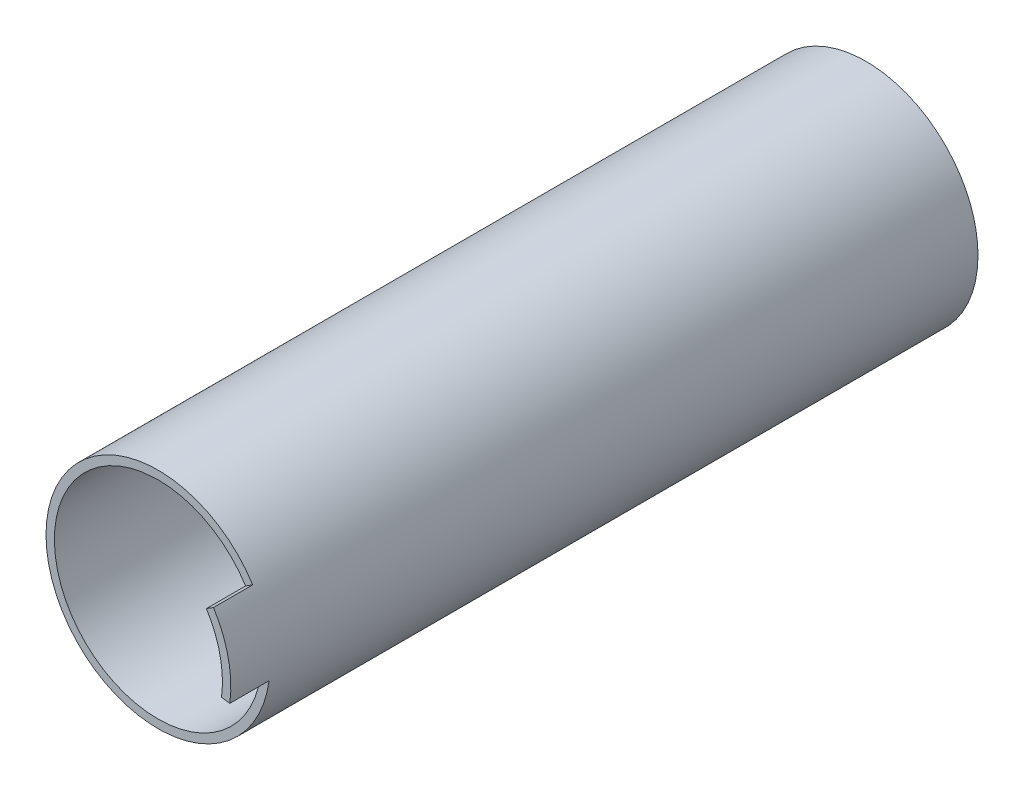
ISO-10303-21;
HEADER;
FILE_DESCRIPTION(('STEP AP214'),'2;1');
FILE_NAME('part.step','',(''),(''),'','','');
FILE_SCHEMA(('AUTOMOTIVE_DESIGN { 1 0 10303 214 1 1 1 1 }'));
ENDSEC;
DATA;
#1=APPLICATION_CONTEXT('core data for automotive mechanical design processes');
#2=APPLICATION_PROTOCOL_DEFINITION('international standard','automotive_design',2000,#1);
#3=PRODUCT_CONTEXT('',#1,'mechanical');
#4=PRODUCT('Part','Part','',(#3));
#5=PRODUCT_RELATED_PRODUCT_CATEGORY('part','',(#4));
#6=PRODUCT_DEFINITION_FORMATION('','',#4);
#7=PRODUCT_DEFINITION_CONTEXT('part definition',#1,'design');
#8=PRODUCT_DEFINITION('design','',#6,#7);
#9=PRODUCT_DEFINITION_SHAPE('','',#8);
#10=(LENGTH_UNIT() NAMED_UNIT(*) SI_UNIT(.MILLI.,.METRE.));
#11=(NAMED_UNIT(*) PLANE_ANGLE_UNIT() SI_UNIT($,.RADIAN.));
#12=(NAMED_UNIT(*) SI_UNIT($,.STERADIAN.) SOLID_ANGLE_UNIT());
#13=UNCERTAINTY_MEASURE_WITH_UNIT(LENGTH_MEASURE(1.E-05),#10,'distance_accuracy_value','');
#14=(GEOMETRIC_REPRESENTATION_CONTEXT(3) GLOBAL_UNCERTAINTY_ASSIGNED_CONTEXT((#13)) GLOBAL_UNIT_ASSIGNED_CONTEXT((#10,
#11,#12)) REPRESENTATION_CONTEXT('',''));
#15=CARTESIAN_POINT('',(0.,0.,0.));
#16=DIRECTION('',(0.,0.,1.));
#17=DIRECTION('',(1.,0.,0.));
#18=AXIS2_PLACEMENT_3D('',#15,#16,#17);
#19=CARTESIAN_POINT('',(0.,0.,0.));
#20=DIRECTION('',(0.,0.,-1.));
#21=DIRECTION('',(-1.,0.,0.));
#22=AXIS2_PLACEMENT_3D('',#19,#20,#21);
#23=PLANE('',#22);
#24=CARTESIAN_POINT('',(0.,0.,0.));
#25=DIRECTION('',(0.,0.,1.));
#26=DIRECTION('',(-1.,0.,0.));
#27=AXIS2_PLACEMENT_3D('',#24,#25,#26);
#28=CIRCLE('',#27,5.);
#29=CARTESIAN_POINT('',(-5.,0.,0.));
#30=VERTEX_POINT('',#29);
#31=CARTESIAN_POINT('',(5.,0.,0.));
#32=VERTEX_POINT('',#31);
#33=EDGE_CURVE('E103',#30,#32,#28,.T.);
#34=ORIENTED_EDGE('',*,*,#33,.F.);
#35=DIRECTION('',(0.,-1.,0.));
#36=VECTOR('',#35,1.);
#37=CARTESIAN_POINT('',(-5.,0.,0.));
#38=LINE('',#37,#36);
#39=CARTESIAN_POINT('',(-5.,16.7705098312484,0.));
#40=VERTEX_POINT('',#39);
#41=EDGE_CURVE('E57',#40,#30,#38,.T.);
#42=ORIENTED_EDGE('',*,*,#41,.F.);
#43=CARTESIAN_POINT('',(0.,0.,0.));
#44=DIRECTION('',(0.,0.,1.));
#45=DIRECTION('',(1.,0.,0.));
#46=AXIS2_PLACEMENT_3D('',#43,#44,#45);
#47=CIRCLE('',#46,17.5);
#48=CARTESIAN_POINT('',(5.,16.7705098312484,0.));
#49=VERTEX_POINT('',#48);
#50=EDGE_CURVE('E104',#49,#40,#47,.T.);
#51=ORIENTED_EDGE('',*,*,#50,.F.);
#52=DIRECTION('',(0.,1.,0.));
#53=VECTOR('',#52,1.);
#54=CARTESIAN_POINT('',(5.,0.,0.));
#55=LINE('',#54,#53);
#56=EDGE_CURVE('E93',#32,#49,#55,.T.);
#57=ORIENTED_EDGE('',*,*,#56,.F.);
#58=EDGE_LOOP('',(#34,#42,#51,#57));
#59=FACE_BOUND('',#58,.T.);
#60=CARTESIAN_POINT('',(0.,0.,0.));
#61=DIRECTION('',(0.,0.,1.));
#62=DIRECTION('',(1.,0.,0.));
#63=AXIS2_PLACEMENT_3D('',#60,#61,#62);
#64=CIRCLE('',#63,2.99999999999862);
#65=CARTESIAN_POINT('',(-2.99999999999862,0.,0.));
#66=VERTEX_POINT('',#65);
#67=EDGE_CURVE('E116',#66,#66,#64,.T.);
#68=ORIENTED_EDGE('',*,*,#67,.T.);
#69=EDGE_LOOP('',(#68));
#70=FACE_BOUND('',#69,.T.);
#71=ADVANCED_FACE('F48',(#59,#70),#23,.T.);
#72=CARTESIAN_POINT('',(0.,0.,83.6221445044903));
#73=DIRECTION('',(0.,0.,-1.));
#74=DIRECTION('',(-1.,0.,0.));
#75=AXIS2_PLACEMENT_3D('',#72,#73,#74);
#76=CYLINDRICAL_SURFACE('',#75,5.);
#77=DIRECTION('',(0.,0.,-1.));
#78=VECTOR('',#77,1.);
#79=CARTESIAN_POINT('',(5.,0.,83.6221445044903));
#80=LINE('',#79,#78);
#81=CARTESIAN_POINT('',(5.,0.,58.6));
#82=VERTEX_POINT('',#81);
#83=EDGE_CURVE('E90',#82,#32,#80,.T.);
#84=ORIENTED_EDGE('',*,*,#83,.F.);
#85=CARTESIAN_POINT('',(0.,0.,58.6));
#86=DIRECTION('',(0.,0.,-1.));
#87=DIRECTION('',(-1.,0.,0.));
#88=AXIS2_PLACEMENT_3D('',#85,#86,#87);
#89=CIRCLE('',#88,5.);
#90=CARTESIAN_POINT('',(-5.,0.,58.6));
#91=VERTEX_POINT('',#90);
#92=EDGE_CURVE('E65',#82,#91,#89,.T.);
#93=ORIENTED_EDGE('',*,*,#92,.T.);
#94=DIRECTION('',(0.,0.,-1.));
#95=VECTOR('',#94,1.);
#96=CARTESIAN_POINT('',(-5.,0.,83.6221445044903));
#97=LINE('',#96,#95);
#98=EDGE_CURVE('E109',#91,#30,#97,.T.);
#99=ORIENTED_EDGE('',*,*,#98,.T.);
#100=ORIENTED_EDGE('',*,*,#33,.T.);
#101=EDGE_LOOP('',(#84,#93,#99,#100));
#102=FACE_BOUND('',#101,.T.);
#103=ADVANCED_FACE('F107',(#102),#76,.T.);
#104=CARTESIAN_POINT('',(5.,0.,83.6221445044903));
#105=DIRECTION('',(-1.,0.,0.));
#106=DIRECTION('',(0.,-1.,0.));
#107=AXIS2_PLACEMENT_3D('',#104,#105,#106);
#108=PLANE('',#107);
#109=DIRECTION('',(0.,0.,-1.));
#110=VECTOR('',#109,1.);
#111=CARTESIAN_POINT('',(5.,16.7705098312484,83.6221445044903));
#112=LINE('',#111,#110);
#113=CARTESIAN_POINT('',(5.,16.7705098312484,58.6));
#114=VERTEX_POINT('',#113);
#115=EDGE_CURVE('E85',#114,#49,#112,.T.);
#116=ORIENTED_EDGE('',*,*,#115,.F.);
#117=DIRECTION('',(0.,-1.,0.));
#118=VECTOR('',#117,1.);
#119=CARTESIAN_POINT('',(5.,0.,58.6));
#120=LINE('',#119,#118);
#121=EDGE_CURVE('E95',#114,#82,#120,.T.);
#122=ORIENTED_EDGE('',*,*,#121,.T.);
#123=ORIENTED_EDGE('',*,*,#83,.T.);
#124=ORIENTED_EDGE('',*,*,#56,.T.);
#125=EDGE_LOOP('',(#116,#122,#123,#124));
#126=FACE_BOUND('',#125,.T.);
#127=ADVANCED_FACE('F92',(#126),#108,.F.);
#128=CARTESIAN_POINT('',(0.,0.,83.6221445044903));
#129=DIRECTION('',(0.,0.,-1.));
#130=DIRECTION('',(-1.,0.,0.));
#131=AXIS2_PLACEMENT_3D('',#128,#129,#130);
#132=CYLINDRICAL_SURFACE('',#131,17.5);
#133=DIRECTION('',(0.,0.,-1.));
#134=VECTOR('',#133,1.);
#135=CARTESIAN_POINT('',(-5.,16.7705098312484,83.6221445044903));
#136=LINE('',#135,#134);
#137=CARTESIAN_POINT('',(-5.,16.7705098312484,58.6));
#138=VERTEX_POINT('',#137);
#139=EDGE_CURVE('E120',#138,#40,#136,.T.);
#140=ORIENTED_EDGE('',*,*,#139,.F.);
#141=CARTESIAN_POINT('',(0.,0.,58.6));
#142=DIRECTION('',(0.,0.,-1.));
#143=DIRECTION('',(-1.,0.,0.));
#144=AXIS2_PLACEMENT_3D('',#141,#142,#143);
#145=CIRCLE('',#144,17.5);
#146=EDGE_CURVE('E105',#138,#114,#145,.T.);
#147=ORIENTED_EDGE('',*,*,#146,.T.);
#148=ORIENTED_EDGE('',*,*,#115,.T.);
#149=ORIENTED_EDGE('',*,*,#50,.T.);
#150=EDGE_LOOP('',(#140,#147,#148,#149));
#151=FACE_BOUND('',#150,.T.);
#152=ADVANCED_FACE('F129',(#151),#132,.T.);
#153=CARTESIAN_POINT('',(-5.,0.,83.6221445044903));
#154=DIRECTION('',(1.,0.,0.));
#155=DIRECTION('',(0.,1.,0.));
#156=AXIS2_PLACEMENT_3D('',#153,#154,#155);
#157=PLANE('',#156);
#158=ORIENTED_EDGE('',*,*,#98,.F.);
#159=DIRECTION('',(0.,1.,0.));
#160=VECTOR('',#159,1.);
#161=CARTESIAN_POINT('',(-5.,0.,58.6));
#162=LINE('',#161,#160);
#163=EDGE_CURVE('E121',#91,#138,#162,.T.);
#164=ORIENTED_EDGE('',*,*,#163,.T.);
#165=ORIENTED_EDGE('',*,*,#139,.T.);
#166=ORIENTED_EDGE('',*,*,#41,.T.);
#167=EDGE_LOOP('',(#158,#164,#165,#166));
#168=FACE_BOUND('',#167,.T.);
#169=ADVANCED_FACE('F128',(#168),#157,.F.);
#170=CARTESIAN_POINT('',(0.,0.,83.6221445044903));
#171=DIRECTION('',(0.,0.,-1.));
#172=DIRECTION('',(-1.,0.,0.));
#173=AXIS2_PLACEMENT_3D('',#170,#171,#172);
#174=CYLINDRICAL_SURFACE('',#173,2.99999999999862);
#175=CARTESIAN_POINT('',(0.,0.,58.6));
#176=DIRECTION('',(0.,0.,-1.));
#177=DIRECTION('',(-1.,0.,0.));
#178=AXIS2_PLACEMENT_3D('',#175,#176,#177);
#179=CIRCLE('',#178,2.99999999999862);
#180=CARTESIAN_POINT('',(-2.99999999999862,0.,58.6));
#181=VERTEX_POINT('',#180);
#182=EDGE_CURVE('E13',#181,#181,#179,.T.);
#183=CARTESIAN_POINT('',(-2.99999999999862,0.,58.6));
#184=CARTESIAN_POINT('',(-2.99999999999862,0.,57.9895833333333));
#185=CARTESIAN_POINT('',(-2.99999999999862,0.,57.3791666666667));
#186=CARTESIAN_POINT('',(-2.99999999999862,0.,56.1583333333333));
#187=CARTESIAN_POINT('',(-2.99999999999862,0.,55.5479166666667));
#188=CARTESIAN_POINT('',(-2.99999999999862,0.,54.3270833333333));
#189=CARTESIAN_POINT('',(-2.99999999999862,0.,53.7166666666667));
#190=CARTESIAN_POINT('',(-2.99999999999862,0.,52.4958333333333));
#191=CARTESIAN_POINT('',(-2.99999999999862,0.,51.8854166666667));
#192=CARTESIAN_POINT('',(-2.99999999999862,0.,50.6645833333333));
#193=CARTESIAN_POINT('',(-2.99999999999862,0.,50.0541666666667));
#194=CARTESIAN_POINT('',(-2.99999999999862,0.,48.8333333333333));
#195=CARTESIAN_POINT('',(-2.99999999999862,0.,48.2229166666667));
#196=CARTESIAN_POINT('',(-2.99999999999862,0.,47.0020833333333));
#197=CARTESIAN_POINT('',(-2.99999999999862,0.,46.3916666666667));
#198=CARTESIAN_POINT('',(-2.99999999999862,0.,45.1708333333333));
#199=CARTESIAN_POINT('',(-2.99999999999862,0.,44.5604166666667));
#200=CARTESIAN_POINT('',(-2.99999999999862,0.,43.3395833333333));
#201=CARTESIAN_POINT('',(-2.99999999999862,0.,42.7291666666667));
#202=CARTESIAN_POINT('',(-2.99999999999862,0.,41.5083333333333));
#203=CARTESIAN_POINT('',(-2.99999999999862,0.,40.8979166666667));
#204=CARTESIAN_POINT('',(-2.99999999999862,0.,39.6770833333333));
#205=CARTESIAN_POINT('',(-2.99999999999862,0.,39.0666666666667));
#206=CARTESIAN_POINT('',(-2.99999999999862,0.,37.8458333333333));
#207=CARTESIAN_POINT('',(-2.99999999999862,0.,37.2354166666667));
#208=CARTESIAN_POINT('',(-2.99999999999862,0.,36.0145833333333));
#209=CARTESIAN_POINT('',(-2.99999999999862,0.,35.4041666666667));
#210=CARTESIAN_POINT('',(-2.99999999999862,0.,34.1833333333333));
#211=CARTESIAN_POINT('',(-2.99999999999862,0.,33.5729166666667));
#212=CARTESIAN_POINT('',(-2.99999999999862,0.,32.3520833333333));
#213=CARTESIAN_POINT('',(-2.99999999999862,0.,31.7416666666667));
#214=CARTESIAN_POINT('',(-2.99999999999862,0.,30.5208333333333));
#215=CARTESIAN_POINT('',(-2.99999999999862,0.,29.9104166666667));
#216=CARTESIAN_POINT('',(-2.99999999999862,0.,28.6895833333333));
#217=CARTESIAN_POINT('',(-2.99999999999862,0.,28.0791666666667));
#218=CARTESIAN_POINT('',(-2.99999999999862,0.,26.8583333333333));
#219=CARTESIAN_POINT('',(-2.99999999999862,0.,26.2479166666667));
#220=CARTESIAN_POINT('',(-2.99999999999862,0.,25.0270833333333));
#221=CARTESIAN_POINT('',(-2.99999999999862,0.,24.4166666666667));
#222=CARTESIAN_POINT('',(-2.99999999999862,0.,23.1958333333333));
#223=CARTESIAN_POINT('',(-2.99999999999862,0.,22.5854166666667));
#224=CARTESIAN_POINT('',(-2.99999999999862,0.,21.3645833333333));
#225=CARTESIAN_POINT('',(-2.99999999999862,0.,20.7541666666667));
#226=CARTESIAN_POINT('',(-2.99999999999862,0.,19.5333333333333));
#227=CARTESIAN_POINT('',(-2.99999999999862,0.,18.9229166666667));
#228=CARTESIAN_POINT('',(-2.99999999999862,0.,17.7020833333333));
#229=CARTESIAN_POINT('',(-2.99999999999862,0.,17.0916666666667));
#230=CARTESIAN_POINT('',(-2.99999999999862,0.,15.8708333333333));
#231=CARTESIAN_POINT('',(-2.99999999999862,0.,15.2604166666667));
#232=CARTESIAN_POINT('',(-2.99999999999862,0.,14.0395833333333));
#233=CARTESIAN_POINT('',(-2.99999999999862,0.,13.4291666666667));
#234=CARTESIAN_POINT('',(-2.99999999999862,0.,12.2083333333333));
#235=CARTESIAN_POINT('',(-2.99999999999862,0.,11.5979166666667));
#236=CARTESIAN_POINT('',(-2.99999999999862,0.,10.3770833333333));
#237=CARTESIAN_POINT('',(-2.99999999999862,0.,9.76666666666666));
#238=CARTESIAN_POINT('',(-2.99999999999862,0.,8.54583333333332));
#239=CARTESIAN_POINT('',(-2.99999999999862,0.,7.93541666666665));
#240=CARTESIAN_POINT('',(-2.99999999999862,0.,6.71458333333332));
#241=CARTESIAN_POINT('',(-2.99999999999862,0.,6.10416666666666));
#242=CARTESIAN_POINT('',(-2.99999999999862,0.,4.88333333333332));
#243=CARTESIAN_POINT('',(-2.99999999999862,0.,4.27291666666665));
#244=CARTESIAN_POINT('',(-2.99999999999862,0.,3.05208333333332));
#245=CARTESIAN_POINT('',(-2.99999999999862,0.,2.44166666666666));
#246=CARTESIAN_POINT('',(-2.99999999999862,0.,1.22083333333332));
#247=CARTESIAN_POINT('',(-2.99999999999862,0.,0.610416666666655));
#248=CARTESIAN_POINT('',(-2.99999999999862,0.,0.));
#249=B_SPLINE_CURVE_WITH_KNOTS('',3,(#183,#184,#185,#186,#187,#188,#189,#190,#191,#192,#193,
#194,#195,#196,#197,#198,#199,#200,#201,#202,#203,#204,#205,#206,#207,#208,#209,#210,#211,#212,
#213,#214,#215,#216,#217,#218,#219,#220,#221,#222,#223,#224,#225,#226,#227,#228,#229,#230,#231,
#232,#233,#234,#235,#236,#237,#238,#239,#240,#241,#242,#243,#244,#245,#246,#247,#248),
.UNSPECIFIED.,.F.,.F.,(4,2,2,2,2,2,2,2,2,2,2,2,2,2,2,2,2,2,2,2,2,2,2,2,2,2,2,2,2,2,2,2,4),(0.,
1.83124999999999,3.6625,5.49375,7.325,9.15625,10.9875,12.81875,14.65,16.48125,18.3125,20.14375,
21.975,23.80625,25.6375,27.46875,29.3,31.13125,32.9625,34.79375,36.625,38.45625,40.2875,
42.11875,43.95,45.78125,47.6125,49.44375,51.275,53.10625,54.9375,56.76875,58.6),.UNSPECIFIED.);
#250=EDGE_CURVE('BSEAM131',#181,#66,#249,.T.);
#251=ORIENTED_EDGE('',*,*,#182,.F.);
#252=ORIENTED_EDGE('',*,*,#67,.F.);
#253=ORIENTED_EDGE('',*,*,#250,.T.);
#254=ORIENTED_EDGE('',*,*,#250,.F.);
#255=EDGE_LOOP('',(#251,#253,#252,#254));
#256=FACE_BOUND('',#255,.T.);
#257=ADVANCED_FACE('F131',(#256),#174,.F.);
#258=CARTESIAN_POINT('',(0.,-5.01335084557297E-13,58.6));
#259=DIRECTION('',(0.,0.,-1.));
#260=DIRECTION('',(-1.,0.,0.));
#261=AXIS2_PLACEMENT_3D('',#258,#259,#260);
#262=PLANE('',#261);
#263=ORIENTED_EDGE('',*,*,#182,.T.);
#264=EDGE_LOOP('',(#263));
#265=FACE_BOUND('',#264,.T.);
#266=ORIENTED_EDGE('',*,*,#121,.F.);
#267=ORIENTED_EDGE('',*,*,#146,.F.);
#268=ORIENTED_EDGE('',*,*,#163,.F.);
#269=ORIENTED_EDGE('',*,*,#92,.F.);
#270=EDGE_LOOP('',(#266,#267,#268,#269));
#271=FACE_BOUND('',#270,.T.);
#272=ADVANCED_FACE('F50',(#265,#271),#262,.F.);
#273=CLOSED_SHELL('',(#71,#103,#127,#152,#169,#257,#272));
#274=MANIFOLD_SOLID_BREP('B2',#273);
#275=CARTESIAN_POINT('',(-7.41124908692476,8.1285538056629,126.4));
#276=DIRECTION('',(0.,0.,-1.));
#277=DIRECTION('',(-1.,0.,0.));
#278=AXIS2_PLACEMENT_3D('',#275,#276,#277);
#279=CYLINDRICAL_SURFACE('',#278,6.);
#280=CARTESIAN_POINT('',(-7.41124908692476,8.1285538056629,67.4));
#281=DIRECTION('',(0.,0.,-1.));
#282=DIRECTION('',(-1.,0.,0.));
#283=AXIS2_PLACEMENT_3D('',#280,#281,#282);
#284=CIRCLE('',#283,6.);
#285=CARTESIAN_POINT('',(-1.49013878743609,9.09832327377844,67.4));
#286=VERTEX_POINT('',#285);
#287=CARTESIAN_POINT('',(-3.3687495849658,3.69479718439223,67.4));
#288=VERTEX_POINT('',#287);
#289=EDGE_CURVE('E317',#286,#288,#284,.T.);
#290=ORIENTED_EDGE('',*,*,#289,.F.);
#291=DIRECTION('',(0.,0.,-1.));
#292=VECTOR('',#291,1.);
#293=CARTESIAN_POINT('',(-1.49013878743609,9.09832327377844,126.4));
#294=LINE('',#293,#292);
#295=CARTESIAN_POINT('',(-1.49013878743609,9.09832327377844,59.));
#296=VERTEX_POINT('',#295);
#297=EDGE_CURVE('E350',#286,#296,#294,.T.);
#298=ORIENTED_EDGE('',*,*,#297,.T.);
#299=CARTESIAN_POINT('',(-7.41124908692476,8.1285538056629,59.));
#300=DIRECTION('',(0.,0.,-1.));
#301=DIRECTION('',(-1.,0.,0.));
#302=AXIS2_PLACEMENT_3D('',#299,#300,#301);
#303=CIRCLE('',#302,6.);
#304=CARTESIAN_POINT('',(-3.3687495849658,3.69479718439223,59.));
#305=VERTEX_POINT('',#304);
#306=EDGE_CURVE('E338',#296,#305,#303,.T.);
#307=ORIENTED_EDGE('',*,*,#306,.T.);
#308=DIRECTION('',(0.,0.,-1.));
#309=VECTOR('',#308,1.);
#310=CARTESIAN_POINT('',(-3.3687495849658,3.69479718439223,126.4));
#311=LINE('',#310,#309);
#312=EDGE_CURVE('E351',#288,#305,#311,.T.);
#313=ORIENTED_EDGE('',*,*,#312,.F.);
#314=EDGE_LOOP('',(#290,#298,#307,#313));
#315=FACE_BOUND('',#314,.T.);
#316=ADVANCED_FACE('F193',(#315),#279,.F.);
#317=CARTESIAN_POINT('',(0.,0.,126.4));
#318=DIRECTION('',(0.,0.,-1.));
#319=DIRECTION('',(-1.,0.,0.));
#320=AXIS2_PLACEMENT_3D('',#317,#318,#319);
#321=CYLINDRICAL_SURFACE('',#320,5.);
#322=CARTESIAN_POINT('',(0.,0.,67.4));
#323=DIRECTION('',(0.,0.,-1.));
#324=DIRECTION('',(-1.,0.,0.));
#325=AXIS2_PLACEMENT_3D('',#322,#323,#324);
#326=CIRCLE('',#325,5.);
#327=CARTESIAN_POINT('',(2.72727272727273,4.19070202604222,67.4));
#328=VERTEX_POINT('',#327);
#329=EDGE_CURVE('E319',#288,#328,#326,.F.);
#330=ORIENTED_EDGE('',*,*,#329,.F.);
#331=ORIENTED_EDGE('',*,*,#312,.T.);
#332=CARTESIAN_POINT('',(0.,0.,59.));
#333=DIRECTION('',(0.,0.,-1.));
#334=DIRECTION('',(-1.,0.,0.));
#335=AXIS2_PLACEMENT_3D('',#332,#333,#334);
#336=CIRCLE('',#335,5.);
#337=CARTESIAN_POINT('',(2.72727272727273,4.19070202604222,59.));
#338=VERTEX_POINT('',#337);
#339=EDGE_CURVE('E341',#305,#338,#336,.F.);
#340=ORIENTED_EDGE('',*,*,#339,.T.);
#341=DIRECTION('',(0.,0.,-1.));
#342=VECTOR('',#341,1.);
#343=CARTESIAN_POINT('',(2.72727272727273,4.19070202604222,126.4));
#344=LINE('',#343,#342);
#345=EDGE_CURVE('E354',#328,#338,#344,.T.);
#346=ORIENTED_EDGE('',*,*,#345,.F.);
#347=EDGE_LOOP('',(#330,#331,#340,#346));
#348=FACE_BOUND('',#347,.T.);
#349=ADVANCED_FACE('F407',(#348),#321,.T.);
#350=CARTESIAN_POINT('',(6.,9.21954445729289,126.4));
#351=DIRECTION('',(0.,0.,-1.));
#352=DIRECTION('',(-1.,0.,0.));
#353=AXIS2_PLACEMENT_3D('',#350,#351,#352);
#354=CYLINDRICAL_SURFACE('',#353,6.);
#355=CARTESIAN_POINT('',(6.,9.21954445729289,67.4));
#356=DIRECTION('',(0.,0.,-1.));
#357=DIRECTION('',(-1.,0.,0.));
#358=AXIS2_PLACEMENT_3D('',#355,#356,#357);
#359=CIRCLE('',#358,6.);
#360=CARTESIAN_POINT('',(0.,9.21954445729289,67.4));
#361=VERTEX_POINT('',#360);
#362=EDGE_CURVE('E321',#328,#361,#359,.T.);
#363=ORIENTED_EDGE('',*,*,#362,.F.);
#364=ORIENTED_EDGE('',*,*,#345,.T.);
#365=CARTESIAN_POINT('',(6.,9.21954445729289,59.));
#366=DIRECTION('',(0.,0.,-1.));
#367=DIRECTION('',(-1.,0.,0.));
#368=AXIS2_PLACEMENT_3D('',#365,#366,#367);
#369=CIRCLE('',#368,6.);
#370=CARTESIAN_POINT('',(0.,9.21954445729289,59.));
#371=VERTEX_POINT('',#370);
#372=EDGE_CURVE('E344',#338,#371,#369,.T.);
#373=ORIENTED_EDGE('',*,*,#372,.T.);
#374=DIRECTION('',(0.,0.,-1.));
#375=VECTOR('',#374,1.);
#376=CARTESIAN_POINT('',(0.,9.21954445729289,126.4));
#377=LINE('',#376,#375);
#378=EDGE_CURVE('E356',#361,#371,#377,.T.);
#379=ORIENTED_EDGE('',*,*,#378,.F.);
#380=EDGE_LOOP('',(#363,#364,#373,#379));
#381=FACE_BOUND('',#380,.T.);
#382=ADVANCED_FACE('F402',(#381),#354,.F.);
#383=CARTESIAN_POINT('',(0.,18.5,126.4));
#384=DIRECTION('',(1.,0.,0.));
#385=DIRECTION('',(0.,1.,0.));
#386=AXIS2_PLACEMENT_3D('',#383,#384,#385);
#387=PLANE('',#386);
#388=DIRECTION('',(0.,1.,0.));
#389=VECTOR('',#388,1.);
#390=CARTESIAN_POINT('',(0.,18.5,67.4));
#391=LINE('',#390,#389);
#392=CARTESIAN_POINT('',(0.,18.5,67.4));
#393=VERTEX_POINT('',#392);
#394=EDGE_CURVE('E323',#361,#393,#391,.T.);
#395=ORIENTED_EDGE('',*,*,#394,.F.);
#396=ORIENTED_EDGE('',*,*,#378,.T.);
#397=DIRECTION('',(0.,1.,0.));
#398=VECTOR('',#397,1.);
#399=CARTESIAN_POINT('',(0.,18.5,59.));
#400=LINE('',#399,#398);
#401=CARTESIAN_POINT('',(0.,18.5,59.));
#402=VERTEX_POINT('',#401);
#403=EDGE_CURVE('E347',#371,#402,#400,.T.);
#404=ORIENTED_EDGE('',*,*,#403,.T.);
#405=DIRECTION('',(0.,0.,-1.));
#406=VECTOR('',#405,1.);
#407=CARTESIAN_POINT('',(0.,18.5,126.4));
#408=LINE('',#407,#406);
#409=EDGE_CURVE('E361',#393,#402,#408,.T.);
#410=ORIENTED_EDGE('',*,*,#409,.F.);
#411=EDGE_LOOP('',(#395,#396,#404,#410));
#412=FACE_BOUND('',#411,.T.);
#413=ADVANCED_FACE('F398',(#412),#387,.T.);
#414=CARTESIAN_POINT('',(-2.99012252668958,18.2567567567568,126.4));
#415=DIRECTION('',(-0.986851716581446,-0.161628244685923,0.));
#416=DIRECTION('',(0.161628244685923,-0.986851716581447,0.));
#417=AXIS2_PLACEMENT_3D('',#414,#415,#416);
#418=PLANE('',#417);
#419=DIRECTION('',(0.161628244685923,-0.986851716581447,0.));
#420=VECTOR('',#419,1.);
#421=CARTESIAN_POINT('',(-2.99012252668958,18.2567567567568,67.4));
#422=LINE('',#421,#420);
#423=CARTESIAN_POINT('',(-2.99012252668958,18.2567567567568,67.4));
#424=VERTEX_POINT('',#423);
#425=EDGE_CURVE('E315',#424,#286,#422,.T.);
#426=ORIENTED_EDGE('',*,*,#425,.F.);
#427=DIRECTION('',(0.,0.,-1.));
#428=VECTOR('',#427,1.);
#429=CARTESIAN_POINT('',(-2.99012252668958,18.2567567567568,126.4));
#430=LINE('',#429,#428);
#431=CARTESIAN_POINT('',(-2.99012252668958,18.2567567567568,59.));
#432=VERTEX_POINT('',#431);
#433=EDGE_CURVE('E364',#424,#432,#430,.T.);
#434=ORIENTED_EDGE('',*,*,#433,.T.);
#435=DIRECTION('',(0.161628244685923,-0.986851716581447,0.));
#436=VECTOR('',#435,1.);
#437=CARTESIAN_POINT('',(-2.99012252668958,18.2567567567568,59.));
#438=LINE('',#437,#436);
#439=EDGE_CURVE('E335',#432,#296,#438,.T.);
#440=ORIENTED_EDGE('',*,*,#439,.T.);
#441=ORIENTED_EDGE('',*,*,#297,.F.);
#442=EDGE_LOOP('',(#426,#434,#440,#441));
#443=FACE_BOUND('',#442,.T.);
#444=ADVANCED_FACE('F414',(#443),#418,.T.);
#445=CARTESIAN_POINT('',(0.,0.,126.4));
#446=DIRECTION('',(0.,0.,-1.));
#447=DIRECTION('',(-1.,0.,0.));
#448=AXIS2_PLACEMENT_3D('',#445,#446,#447);
#449=CYLINDRICAL_SURFACE('',#448,3.);
#450=CARTESIAN_POINT('',(0.,0.,67.4));
#451=DIRECTION('',(0.,0.,-1.));
#452=DIRECTION('',(-1.,0.,0.));
#453=AXIS2_PLACEMENT_3D('',#450,#451,#452);
#454=CIRCLE('',#453,3.);
#455=CARTESIAN_POINT('',(-3.,0.,67.4));
#456=VERTEX_POINT('',#455);
#457=EDGE_CURVE('E311',#456,#456,#454,.F.);
#458=ORIENTED_EDGE('',*,*,#457,.T.);
#459=EDGE_LOOP('',(#458));
#460=FACE_BOUND('',#459,.T.);
#461=CARTESIAN_POINT('',(0.,0.,59.));
#462=DIRECTION('',(0.,0.,-1.));
#463=DIRECTION('',(-1.,0.,0.));
#464=AXIS2_PLACEMENT_3D('',#461,#462,#463);
#465=CIRCLE('',#464,3.);
#466=CARTESIAN_POINT('',(-3.,0.,59.));
#467=VERTEX_POINT('',#466);
#468=EDGE_CURVE('E197',#467,#467,#465,.F.);
#469=ORIENTED_EDGE('',*,*,#468,.F.);
#470=EDGE_LOOP('',(#469));
#471=FACE_BOUND('',#470,.T.);
#472=ADVANCED_FACE('F439',(#460,#471),#449,.F.);
#473=CARTESIAN_POINT('',(0.,0.,126.4));
#474=DIRECTION('',(0.,0.,1.));
#475=DIRECTION('',(1.,0.,0.));
#476=AXIS2_PLACEMENT_3D('',#473,#474,#475);
#477=PLANE('',#476);
#478=DIRECTION('',(0.991029909341494,-0.133640258869065,0.));
#479=VECTOR('',#478,1.);
#480=CARTESIAN_POINT('',(19.8205981868299,-2.6728051773813,126.4));
#481=LINE('',#480,#479);
#482=CARTESIAN_POINT('',(18.3340533228176,-2.4723447890777,126.4));
#483=VERTEX_POINT('',#482);
#484=CARTESIAN_POINT('',(19.8205981868299,-2.6728051773813,126.4));
#485=VERTEX_POINT('',#484);
#486=EDGE_CURVE('E299',#483,#485,#481,.T.);
#487=ORIENTED_EDGE('',*,*,#486,.F.);
#488=CARTESIAN_POINT('',(0.,0.,126.4));
#489=DIRECTION('',(0.,0.,1.));
#490=DIRECTION('',(1.,0.,0.));
#491=AXIS2_PLACEMENT_3D('',#488,#489,#490);
#492=CIRCLE('',#491,18.5);
#493=CARTESIAN_POINT('',(-2.99012252668958,18.2567567567568,126.4));
#494=VERTEX_POINT('',#493);
#495=EDGE_CURVE('E366',#494,#483,#492,.T.);
#496=ORIENTED_EDGE('',*,*,#495,.F.);
#497=DIRECTION('',(-0.996707508896528,-0.0810810810810807,0.));
#498=VECTOR('',#497,1.);
#499=CARTESIAN_POINT('',(0.,18.5,126.4));
#500=LINE('',#499,#498);
#501=CARTESIAN_POINT('',(0.,18.5,126.4));
#502=VERTEX_POINT('',#501);
#503=EDGE_CURVE('E302',#502,#494,#500,.T.);
#504=ORIENTED_EDGE('',*,*,#503,.F.);
#505=CARTESIAN_POINT('',(15.6338922650837,9.89097632409239,126.4));
#506=VERTEX_POINT('',#505);
#507=EDGE_CURVE('E369',#506,#502,#492,.T.);
#508=ORIENTED_EDGE('',*,*,#507,.F.);
#509=DIRECTION('',(-0.845075257572092,-0.534647368869859,0.));
#510=VECTOR('',#509,1.);
#511=CARTESIAN_POINT('',(16.9015051514418,10.6929473773972,126.4));
#512=LINE('',#511,#510);
#513=CARTESIAN_POINT('',(16.9015051514418,10.6929473773972,126.4));
#514=VERTEX_POINT('',#513);
#515=EDGE_CURVE('E213',#514,#506,#512,.T.);
#516=ORIENTED_EDGE('',*,*,#515,.F.);
#517=CARTESIAN_POINT('',(0.,0.,126.4));
#518=DIRECTION('',(0.,0.,1.));
#519=DIRECTION('',(1.,0.,0.));
#520=AXIS2_PLACEMENT_3D('',#517,#518,#519);
#521=CIRCLE('',#520,20.);
#522=EDGE_CURVE('E46',#514,#485,#521,.T.);
#523=ORIENTED_EDGE('',*,*,#522,.T.);
#524=EDGE_LOOP('',(#487,#496,#504,#508,#516,#523));
#525=FACE_BOUND('',#524,.T.);
#526=ADVANCED_FACE('F377',(#525),#477,.T.);
#527=CARTESIAN_POINT('',(0.,0.,0.));
#528=DIRECTION('',(0.,0.,1.));
#529=DIRECTION('',(1.,0.,0.));
#530=AXIS2_PLACEMENT_3D('',#527,#528,#529);
#531=PLANE('',#530);
#532=CARTESIAN_POINT('',(0.,0.,0.));
#533=DIRECTION('',(0.,0.,1.));
#534=DIRECTION('',(1.,0.,0.));
#535=AXIS2_PLACEMENT_3D('',#532,#533,#534);
#536=CIRCLE('',#535,20.);
#537=CARTESIAN_POINT('',(20.,0.,0.));
#538=VERTEX_POINT('',#537);
#539=EDGE_CURVE('E202',#538,#538,#536,.T.);
#540=ORIENTED_EDGE('',*,*,#539,.F.);
#541=EDGE_LOOP('',(#540));
#542=FACE_BOUND('',#541,.T.);
#543=CARTESIAN_POINT('',(0.,0.,0.));
#544=DIRECTION('',(0.,0.,1.));
#545=DIRECTION('',(1.,0.,0.));
#546=AXIS2_PLACEMENT_3D('',#543,#544,#545);
#547=CIRCLE('',#546,18.5);
#548=CARTESIAN_POINT('',(-2.99012252668958,18.2567567567568,0.));
#549=VERTEX_POINT('',#548);
#550=CARTESIAN_POINT('',(0.,18.5,0.));
#551=VERTEX_POINT('',#550);
#552=EDGE_CURVE('E353',#549,#551,#547,.T.);
#553=ORIENTED_EDGE('',*,*,#552,.T.);
#554=DIRECTION('',(0.996707508896528,0.0810810810810807,0.));
#555=VECTOR('',#554,1.);
#556=CARTESIAN_POINT('',(0.,18.5,0.));
#557=LINE('',#556,#555);
#558=EDGE_CURVE('E325',#549,#551,#557,.T.);
#559=ORIENTED_EDGE('',*,*,#558,.F.);
#560=EDGE_LOOP('',(#553,#559));
#561=FACE_BOUND('',#560,.T.);
#562=ADVANCED_FACE('F374',(#542,#561),#531,.F.);
#563=CARTESIAN_POINT('',(0.,0.,126.4));
#564=DIRECTION('',(0.,0.,-1.));
#565=DIRECTION('',(-1.,0.,0.));
#566=AXIS2_PLACEMENT_3D('',#563,#564,#565);
#567=CYLINDRICAL_SURFACE('',#566,20.);
#568=ORIENTED_EDGE('',*,*,#522,.F.);
#569=DIRECTION('',(0.,0.,-1.));
#570=VECTOR('',#569,1.);
#571=CARTESIAN_POINT('',(16.9015051514418,10.6929473773972,133.4));
#572=LINE('',#571,#570);
#573=CARTESIAN_POINT('',(16.9015051514418,10.6929473773972,133.4));
#574=VERTEX_POINT('',#573);
#575=EDGE_CURVE('E284',#574,#514,#572,.T.);
#576=ORIENTED_EDGE('',*,*,#575,.F.);
#577=CARTESIAN_POINT('',(0.,0.,133.4));
#578=DIRECTION('',(0.,0.,1.));
#579=DIRECTION('',(-1.,0.,0.));
#580=AXIS2_PLACEMENT_3D('',#577,#578,#579);
#581=CIRCLE('',#580,20.);
#582=CARTESIAN_POINT('',(19.8205981868299,-2.6728051773813,133.4));
#583=VERTEX_POINT('',#582);
#584=EDGE_CURVE('E290',#583,#574,#581,.T.);
#585=ORIENTED_EDGE('',*,*,#584,.F.);
#586=DIRECTION('',(0.,0.,-1.));
#587=VECTOR('',#586,1.);
#588=CARTESIAN_POINT('',(19.8205981868299,-2.6728051773813,133.4));
#589=LINE('',#588,#587);
#590=EDGE_CURVE('E427',#583,#485,#589,.T.);
#591=ORIENTED_EDGE('',*,*,#590,.T.);
#592=EDGE_LOOP('',(#568,#576,#585,#591));
#593=FACE_BOUND('',#592,.T.);
#594=ORIENTED_EDGE('',*,*,#539,.T.);
#595=EDGE_LOOP('',(#594));
#596=FACE_BOUND('',#595,.T.);
#597=ADVANCED_FACE('F195',(#593,#596),#567,.T.);
#598=CARTESIAN_POINT('',(0.,0.,126.4));
#599=DIRECTION('',(0.,0.,-1.));
#600=DIRECTION('',(-1.,0.,0.));
#601=AXIS2_PLACEMENT_3D('',#598,#599,#600);
#602=CYLINDRICAL_SURFACE('',#601,18.5);
#603=ORIENTED_EDGE('',*,*,#433,.F.);
#604=EDGE_CURVE('E362',#494,#424,#430,.T.);
#605=ORIENTED_EDGE('',*,*,#604,.F.);
#606=ORIENTED_EDGE('',*,*,#495,.T.);
#607=DIRECTION('',(0.,0.,-1.));
#608=VECTOR('',#607,1.);
#609=CARTESIAN_POINT('',(18.3340533228176,-2.4723447890777,133.4));
#610=LINE('',#609,#608);
#611=CARTESIAN_POINT('',(18.3340533228176,-2.4723447890777,133.4));
#612=VERTEX_POINT('',#611);
#613=EDGE_CURVE('E306',#612,#483,#610,.T.);
#614=ORIENTED_EDGE('',*,*,#613,.F.);
#615=CARTESIAN_POINT('',(0.,0.,133.4));
#616=DIRECTION('',(0.,0.,-1.));
#617=DIRECTION('',(-1.,0.,0.));
#618=AXIS2_PLACEMENT_3D('',#615,#616,#617);
#619=CIRCLE('',#618,18.5);
#620=CARTESIAN_POINT('',(15.6338922650837,9.89097632409239,133.4));
#621=VERTEX_POINT('',#620);
#622=EDGE_CURVE('E289',#621,#612,#619,.T.);
#623=ORIENTED_EDGE('',*,*,#622,.F.);
#624=DIRECTION('',(0.,0.,-1.));
#625=VECTOR('',#624,1.);
#626=CARTESIAN_POINT('',(15.6338922650837,9.89097632409239,133.4));
#627=LINE('',#626,#625);
#628=EDGE_CURVE('E286',#621,#506,#627,.T.);
#629=ORIENTED_EDGE('',*,*,#628,.T.);
#630=ORIENTED_EDGE('',*,*,#507,.T.);
#631=EDGE_CURVE('E358',#502,#393,#408,.T.);
#632=ORIENTED_EDGE('',*,*,#631,.T.);
#633=ORIENTED_EDGE('',*,*,#409,.T.);
#634=DIRECTION('',(0.,0.,-1.));
#635=VECTOR('',#634,1.);
#636=CARTESIAN_POINT('',(0.,18.5,59.));
#637=LINE('',#636,#635);
#638=EDGE_CURVE('E331',#402,#551,#637,.T.);
#639=ORIENTED_EDGE('',*,*,#638,.T.);
#640=ORIENTED_EDGE('',*,*,#552,.F.);
#641=DIRECTION('',(0.,0.,-1.));
#642=VECTOR('',#641,1.);
#643=CARTESIAN_POINT('',(-2.99012252668958,18.2567567567568,59.));
#644=LINE('',#643,#642);
#645=EDGE_CURVE('E329',#432,#549,#644,.T.);
#646=ORIENTED_EDGE('',*,*,#645,.F.);
#647=EDGE_LOOP('',(#603,#605,#606,#614,#623,#629,#630,#632,#633,#639,#640,#646));
#648=FACE_BOUND('',#647,.T.);
#649=ADVANCED_FACE('F383',(#648),#602,.F.);
#650=CARTESIAN_POINT('',(0.,-5.01335084557297E-13,59.));
#651=DIRECTION('',(0.,0.,-1.));
#652=DIRECTION('',(-1.,0.,0.));
#653=AXIS2_PLACEMENT_3D('',#650,#651,#652);
#654=PLANE('',#653);
#655=ORIENTED_EDGE('',*,*,#372,.F.);
#656=ORIENTED_EDGE('',*,*,#339,.F.);
#657=ORIENTED_EDGE('',*,*,#306,.F.);
#658=ORIENTED_EDGE('',*,*,#439,.F.);
#659=DIRECTION('',(0.996707508896528,0.0810810810810807,0.));
#660=VECTOR('',#659,1.);
#661=CARTESIAN_POINT('',(0.,18.5,59.));
#662=LINE('',#661,#660);
#663=EDGE_CURVE('E326',#432,#402,#662,.T.);
#664=ORIENTED_EDGE('',*,*,#663,.T.);
#665=ORIENTED_EDGE('',*,*,#403,.F.);
#666=EDGE_LOOP('',(#655,#656,#657,#658,#664,#665));
#667=FACE_BOUND('',#666,.T.);
#668=ORIENTED_EDGE('',*,*,#468,.T.);
#669=EDGE_LOOP('',(#668));
#670=FACE_BOUND('',#669,.T.);
#671=ADVANCED_FACE('F393',(#667,#670),#654,.T.);
#672=CARTESIAN_POINT('',(0.,18.5,59.));
#673=DIRECTION('',(-0.0810810810810807,0.996707508896528,0.));
#674=DIRECTION('',(-0.996707508896528,-0.0810810810810807,0.));
#675=AXIS2_PLACEMENT_3D('',#672,#673,#674);
#676=PLANE('',#675);
#677=ORIENTED_EDGE('',*,*,#558,.T.);
#678=ORIENTED_EDGE('',*,*,#638,.F.);
#679=ORIENTED_EDGE('',*,*,#663,.F.);
#680=ORIENTED_EDGE('',*,*,#645,.T.);
#681=EDGE_LOOP('',(#677,#678,#679,#680));
#682=FACE_BOUND('',#681,.T.);
#683=ADVANCED_FACE('F388',(#682),#676,.F.);
#684=CARTESIAN_POINT('',(2.05508176448488E-07,-2.52625562309483E-06,67.4));
#685=DIRECTION('',(0.,0.,-1.));
#686=DIRECTION('',(-1.,0.,0.));
#687=AXIS2_PLACEMENT_3D('',#684,#685,#686);
#688=PLANE('',#687);
#689=ORIENTED_EDGE('',*,*,#394,.T.);
#690=DIRECTION('',(-0.996707508896528,-0.0810810810810807,0.));
#691=VECTOR('',#690,1.);
#692=CARTESIAN_POINT('',(0.,18.5,67.4));
#693=LINE('',#692,#691);
#694=EDGE_CURVE('E304',#393,#424,#693,.T.);
#695=ORIENTED_EDGE('',*,*,#694,.T.);
#696=ORIENTED_EDGE('',*,*,#425,.T.);
#697=ORIENTED_EDGE('',*,*,#289,.T.);
#698=ORIENTED_EDGE('',*,*,#329,.T.);
#699=ORIENTED_EDGE('',*,*,#362,.T.);
#700=EDGE_LOOP('',(#689,#695,#696,#697,#698,#699));
#701=FACE_BOUND('',#700,.T.);
#702=ORIENTED_EDGE('',*,*,#457,.F.);
#703=EDGE_LOOP('',(#702));
#704=FACE_BOUND('',#703,.T.);
#705=ADVANCED_FACE('F433',(#701,#704),#688,.F.);
#706=CARTESIAN_POINT('',(0.,18.5,67.4));
#707=DIRECTION('',(-0.0810810810810807,0.996707508896528,0.));
#708=DIRECTION('',(-0.996707508896528,-0.0810810810810807,0.));
#709=AXIS2_PLACEMENT_3D('',#706,#707,#708);
#710=PLANE('',#709);
#711=ORIENTED_EDGE('',*,*,#503,.T.);
#712=ORIENTED_EDGE('',*,*,#604,.T.);
#713=ORIENTED_EDGE('',*,*,#694,.F.);
#714=ORIENTED_EDGE('',*,*,#631,.F.);
#715=EDGE_LOOP('',(#711,#712,#713,#714));
#716=FACE_BOUND('',#715,.T.);
#717=ADVANCED_FACE('F431',(#716),#710,.F.);
#718=CARTESIAN_POINT('',(16.9015051514418,10.6929473773972,133.4));
#719=DIRECTION('',(0.534647368869858,-0.845075257572092,0.));
#720=DIRECTION('',(0.845075257572092,0.534647368869858,0.));
#721=AXIS2_PLACEMENT_3D('',#718,#719,#720);
#722=PLANE('',#721);
#723=ORIENTED_EDGE('',*,*,#515,.T.);
#724=ORIENTED_EDGE('',*,*,#628,.F.);
#725=DIRECTION('',(-0.845075257572092,-0.534647368869859,0.));
#726=VECTOR('',#725,1.);
#727=CARTESIAN_POINT('',(16.9015051514418,10.6929473773972,133.4));
#728=LINE('',#727,#726);
#729=EDGE_CURVE('E280',#574,#621,#728,.T.);
#730=ORIENTED_EDGE('',*,*,#729,.F.);
#731=ORIENTED_EDGE('',*,*,#575,.T.);
#732=EDGE_LOOP('',(#723,#724,#730,#731));
#733=FACE_BOUND('',#732,.T.);
#734=ADVANCED_FACE('F282',(#733),#722,.F.);
#735=CARTESIAN_POINT('',(19.8205981868299,-2.6728051773813,133.4));
#736=DIRECTION('',(0.133640258869065,0.991029909341494,0.));
#737=DIRECTION('',(-0.991029909341494,0.133640258869065,0.));
#738=AXIS2_PLACEMENT_3D('',#735,#736,#737);
#739=PLANE('',#738);
#740=ORIENTED_EDGE('',*,*,#486,.T.);
#741=ORIENTED_EDGE('',*,*,#590,.F.);
#742=DIRECTION('',(0.991029909341494,-0.133640258869065,0.));
#743=VECTOR('',#742,1.);
#744=CARTESIAN_POINT('',(19.8205981868299,-2.6728051773813,133.4));
#745=LINE('',#744,#743);
#746=EDGE_CURVE('E295',#612,#583,#745,.T.);
#747=ORIENTED_EDGE('',*,*,#746,.F.);
#748=ORIENTED_EDGE('',*,*,#613,.T.);
#749=EDGE_LOOP('',(#740,#741,#747,#748));
#750=FACE_BOUND('',#749,.T.);
#751=ADVANCED_FACE('F428',(#750),#739,.F.);
#752=CARTESIAN_POINT('',(0.,0.,133.4));
#753=DIRECTION('',(0.,0.,-1.));
#754=DIRECTION('',(-1.,0.,0.));
#755=AXIS2_PLACEMENT_3D('',#752,#753,#754);
#756=PLANE('',#755);
#757=ORIENTED_EDGE('',*,*,#584,.T.);
#758=ORIENTED_EDGE('',*,*,#729,.T.);
#759=ORIENTED_EDGE('',*,*,#622,.T.);
#760=ORIENTED_EDGE('',*,*,#746,.T.);
#761=EDGE_LOOP('',(#757,#758,#759,#760));
#762=FACE_BOUND('',#761,.T.);
#763=ADVANCED_FACE('F293',(#762),#756,.F.);
#764=CLOSED_SHELL('',(#316,#349,#382,#413,#444,#472,#526,#562,#597,#649,#671,#683,#705,#717,
#734,#751,#763));
#765=MANIFOLD_SOLID_BREP('B7',#764);
#766=ADVANCED_BREP_SHAPE_REPRESENTATION('',(#18,#274,#765),#14);
#767=SHAPE_DEFINITION_REPRESENTATION(#9,#766);
ENDSEC;
END-ISO-10303-21;
